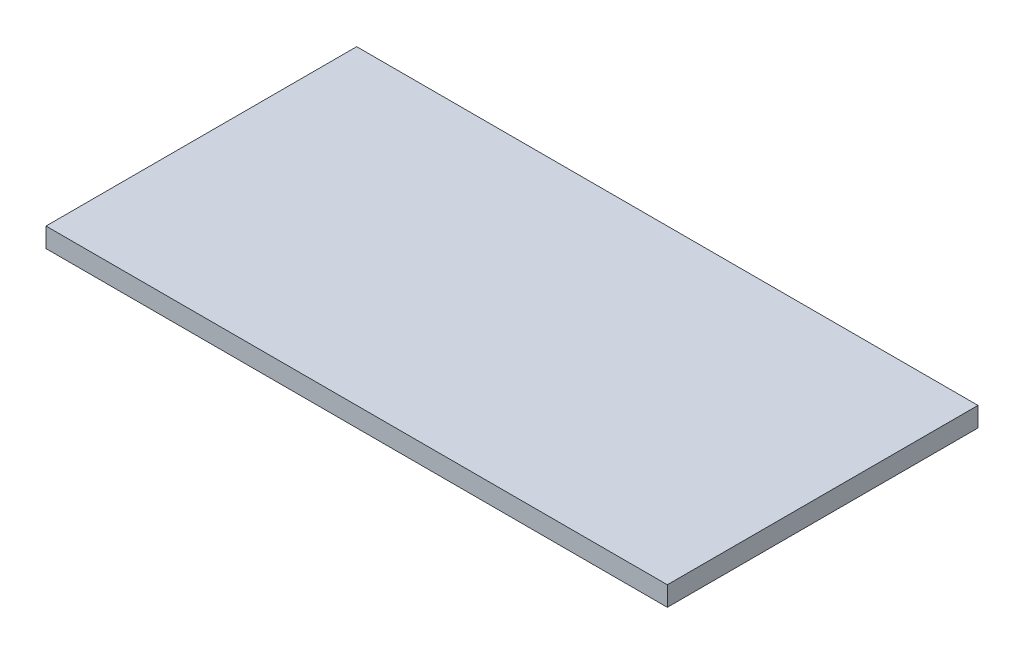
ISO-10303-21;
HEADER;
FILE_DESCRIPTION(('STEP AP214'),'2;1');
FILE_NAME('part.step','',(''),(''),'','','');
FILE_SCHEMA(('AUTOMOTIVE_DESIGN { 1 0 10303 214 1 1 1 1 }'));
ENDSEC;
DATA;
#1=APPLICATION_CONTEXT('core data for automotive mechanical design processes');
#2=APPLICATION_PROTOCOL_DEFINITION('international standard','automotive_design',2000,#1);
#3=PRODUCT_CONTEXT('',#1,'mechanical');
#4=PRODUCT('Part','Part','',(#3));
#5=PRODUCT_RELATED_PRODUCT_CATEGORY('part','',(#4));
#6=PRODUCT_DEFINITION_FORMATION('','',#4);
#7=PRODUCT_DEFINITION_CONTEXT('part definition',#1,'design');
#8=PRODUCT_DEFINITION('design','',#6,#7);
#9=PRODUCT_DEFINITION_SHAPE('','',#8);
#10=(LENGTH_UNIT() NAMED_UNIT(*) SI_UNIT(.MILLI.,.METRE.));
#11=(NAMED_UNIT(*) PLANE_ANGLE_UNIT() SI_UNIT($,.RADIAN.));
#12=(NAMED_UNIT(*) SI_UNIT($,.STERADIAN.) SOLID_ANGLE_UNIT());
#13=UNCERTAINTY_MEASURE_WITH_UNIT(LENGTH_MEASURE(1.E-05),#10,'distance_accuracy_value','');
#14=(GEOMETRIC_REPRESENTATION_CONTEXT(3) GLOBAL_UNCERTAINTY_ASSIGNED_CONTEXT((#13)) GLOBAL_UNIT_ASSIGNED_CONTEXT((#10,
#11,#12)) REPRESENTATION_CONTEXT('',''));
#15=CARTESIAN_POINT('',(0.,0.,0.));
#16=DIRECTION('',(0.,0.,1.));
#17=DIRECTION('',(1.,0.,0.));
#18=AXIS2_PLACEMENT_3D('',#15,#16,#17);
#19=CARTESIAN_POINT('',(25.4,0.8,12.7));
#20=DIRECTION('',(-1.,0.,0.));
#21=DIRECTION('',(0.,0.,1.));
#22=AXIS2_PLACEMENT_3D('',#19,#20,#21);
#23=PLANE('',#22);
#24=DIRECTION('',(0.,0.,-1.));
#25=VECTOR('',#24,1.);
#26=CARTESIAN_POINT('',(25.4,-0.8,12.7));
#27=LINE('',#26,#25);
#28=CARTESIAN_POINT('',(25.4,-0.8,12.7));
#29=VERTEX_POINT('',#28);
#30=CARTESIAN_POINT('',(25.4,-0.8,-12.7));
#31=VERTEX_POINT('',#30);
#32=EDGE_CURVE('E107',#29,#31,#27,.T.);
#33=ORIENTED_EDGE('',*,*,#32,.T.);
#34=DIRECTION('',(0.,-1.,0.));
#35=VECTOR('',#34,1.);
#36=CARTESIAN_POINT('',(25.4,0.8,-12.7));
#37=LINE('',#36,#35);
#38=CARTESIAN_POINT('',(25.4,0.8,-12.7));
#39=VERTEX_POINT('',#38);
#40=EDGE_CURVE('E11',#39,#31,#37,.T.);
#41=ORIENTED_EDGE('',*,*,#40,.F.);
#42=DIRECTION('',(0.,0.,-1.));
#43=VECTOR('',#42,1.);
#44=CARTESIAN_POINT('',(25.4,0.8,12.7));
#45=LINE('',#44,#43);
#46=CARTESIAN_POINT('',(25.4,0.8,12.7));
#47=VERTEX_POINT('',#46);
#48=EDGE_CURVE('E91',#47,#39,#45,.T.);
#49=ORIENTED_EDGE('',*,*,#48,.F.);
#50=DIRECTION('',(0.,-1.,0.));
#51=VECTOR('',#50,1.);
#52=CARTESIAN_POINT('',(25.4,0.8,12.7));
#53=LINE('',#52,#51);
#54=EDGE_CURVE('E103',#47,#29,#53,.T.);
#55=ORIENTED_EDGE('',*,*,#54,.T.);
#56=EDGE_LOOP('',(#33,#41,#49,#55));
#57=FACE_BOUND('',#56,.T.);
#58=ADVANCED_FACE('F39',(#57),#23,.F.);
#59=CARTESIAN_POINT('',(-25.4,0.8,-12.7));
#60=DIRECTION('',(0.,0.,1.));
#61=DIRECTION('',(1.,0.,0.));
#62=AXIS2_PLACEMENT_3D('',#59,#60,#61);
#63=PLANE('',#62);
#64=DIRECTION('',(-1.,0.,0.));
#65=VECTOR('',#64,1.);
#66=CARTESIAN_POINT('',(-25.4,-0.8,-12.7));
#67=LINE('',#66,#65);
#68=CARTESIAN_POINT('',(-25.4,-0.8,-12.7));
#69=VERTEX_POINT('',#68);
#70=EDGE_CURVE('E96',#31,#69,#67,.T.);
#71=ORIENTED_EDGE('',*,*,#70,.T.);
#72=DIRECTION('',(0.,-1.,0.));
#73=VECTOR('',#72,1.);
#74=CARTESIAN_POINT('',(-25.4,0.8,-12.7));
#75=LINE('',#74,#73);
#76=CARTESIAN_POINT('',(-25.4,0.8,-12.7));
#77=VERTEX_POINT('',#76);
#78=EDGE_CURVE('E48',#77,#69,#75,.T.);
#79=ORIENTED_EDGE('',*,*,#78,.F.);
#80=DIRECTION('',(-1.,0.,0.));
#81=VECTOR('',#80,1.);
#82=CARTESIAN_POINT('',(-25.4,0.8,-12.7));
#83=LINE('',#82,#81);
#84=EDGE_CURVE('E86',#39,#77,#83,.T.);
#85=ORIENTED_EDGE('',*,*,#84,.F.);
#86=ORIENTED_EDGE('',*,*,#40,.T.);
#87=EDGE_LOOP('',(#71,#79,#85,#86));
#88=FACE_BOUND('',#87,.T.);
#89=ADVANCED_FACE('F95',(#88),#63,.F.);
#90=CARTESIAN_POINT('',(-25.4,0.8,12.7));
#91=DIRECTION('',(1.,0.,0.));
#92=DIRECTION('',(0.,0.,-1.));
#93=AXIS2_PLACEMENT_3D('',#90,#91,#92);
#94=PLANE('',#93);
#95=DIRECTION('',(0.,0.,1.));
#96=VECTOR('',#95,1.);
#97=CARTESIAN_POINT('',(-25.4,-0.8,12.7));
#98=LINE('',#97,#96);
#99=CARTESIAN_POINT('',(-25.4,-0.8,12.7));
#100=VERTEX_POINT('',#99);
#101=EDGE_CURVE('E73',#69,#100,#98,.T.);
#102=ORIENTED_EDGE('',*,*,#101,.T.);
#103=DIRECTION('',(0.,-1.,0.));
#104=VECTOR('',#103,1.);
#105=CARTESIAN_POINT('',(-25.4,0.8,12.7));
#106=LINE('',#105,#104);
#107=CARTESIAN_POINT('',(-25.4,0.8,12.7));
#108=VERTEX_POINT('',#107);
#109=EDGE_CURVE('E98',#108,#100,#106,.T.);
#110=ORIENTED_EDGE('',*,*,#109,.F.);
#111=DIRECTION('',(0.,0.,1.));
#112=VECTOR('',#111,1.);
#113=CARTESIAN_POINT('',(-25.4,0.8,12.7));
#114=LINE('',#113,#112);
#115=EDGE_CURVE('E89',#77,#108,#114,.T.);
#116=ORIENTED_EDGE('',*,*,#115,.F.);
#117=ORIENTED_EDGE('',*,*,#78,.T.);
#118=EDGE_LOOP('',(#102,#110,#116,#117));
#119=FACE_BOUND('',#118,.T.);
#120=ADVANCED_FACE('F99',(#119),#94,.F.);
#121=CARTESIAN_POINT('',(-25.4,0.8,12.7));
#122=DIRECTION('',(0.,0.,-1.));
#123=DIRECTION('',(-1.,0.,0.));
#124=AXIS2_PLACEMENT_3D('',#121,#122,#123);
#125=PLANE('',#124);
#126=DIRECTION('',(1.,0.,0.));
#127=VECTOR('',#126,1.);
#128=CARTESIAN_POINT('',(-25.4,-0.8,12.7));
#129=LINE('',#128,#127);
#130=EDGE_CURVE('E79',#100,#29,#129,.T.);
#131=ORIENTED_EDGE('',*,*,#130,.T.);
#132=ORIENTED_EDGE('',*,*,#54,.F.);
#133=DIRECTION('',(1.,0.,0.));
#134=VECTOR('',#133,1.);
#135=CARTESIAN_POINT('',(-25.4,0.8,12.7));
#136=LINE('',#135,#134);
#137=EDGE_CURVE('E56',#108,#47,#136,.T.);
#138=ORIENTED_EDGE('',*,*,#137,.F.);
#139=ORIENTED_EDGE('',*,*,#109,.T.);
#140=EDGE_LOOP('',(#131,#132,#138,#139));
#141=FACE_BOUND('',#140,.T.);
#142=ADVANCED_FACE('F120',(#141),#125,.F.);
#143=CARTESIAN_POINT('',(0.,0.8,0.));
#144=DIRECTION('',(0.,-1.,0.));
#145=DIRECTION('',(0.,0.,-1.));
#146=AXIS2_PLACEMENT_3D('',#143,#144,#145);
#147=PLANE('',#146);
#148=ORIENTED_EDGE('',*,*,#48,.T.);
#149=ORIENTED_EDGE('',*,*,#84,.T.);
#150=ORIENTED_EDGE('',*,*,#115,.T.);
#151=ORIENTED_EDGE('',*,*,#137,.T.);
#152=EDGE_LOOP('',(#148,#149,#150,#151));
#153=FACE_BOUND('',#152,.T.);
#154=ADVANCED_FACE('F87',(#153),#147,.F.);
#155=CARTESIAN_POINT('',(0.,-0.8,0.));
#156=DIRECTION('',(0.,-1.,0.));
#157=DIRECTION('',(0.,0.,-1.));
#158=AXIS2_PLACEMENT_3D('',#155,#156,#157);
#159=PLANE('',#158);
#160=ORIENTED_EDGE('',*,*,#32,.F.);
#161=ORIENTED_EDGE('',*,*,#130,.F.);
#162=ORIENTED_EDGE('',*,*,#101,.F.);
#163=ORIENTED_EDGE('',*,*,#70,.F.);
#164=EDGE_LOOP('',(#160,#161,#162,#163));
#165=FACE_BOUND('',#164,.T.);
#166=ADVANCED_FACE('F123',(#165),#159,.T.);
#167=CLOSED_SHELL('',(#58,#89,#120,#142,#154,#166));
#168=MANIFOLD_SOLID_BREP('B2',#167);
#169=ADVANCED_BREP_SHAPE_REPRESENTATION('',(#18,#168),#14);
#170=SHAPE_DEFINITION_REPRESENTATION(#9,#169);
ENDSEC;
END-ISO-10303-21;
